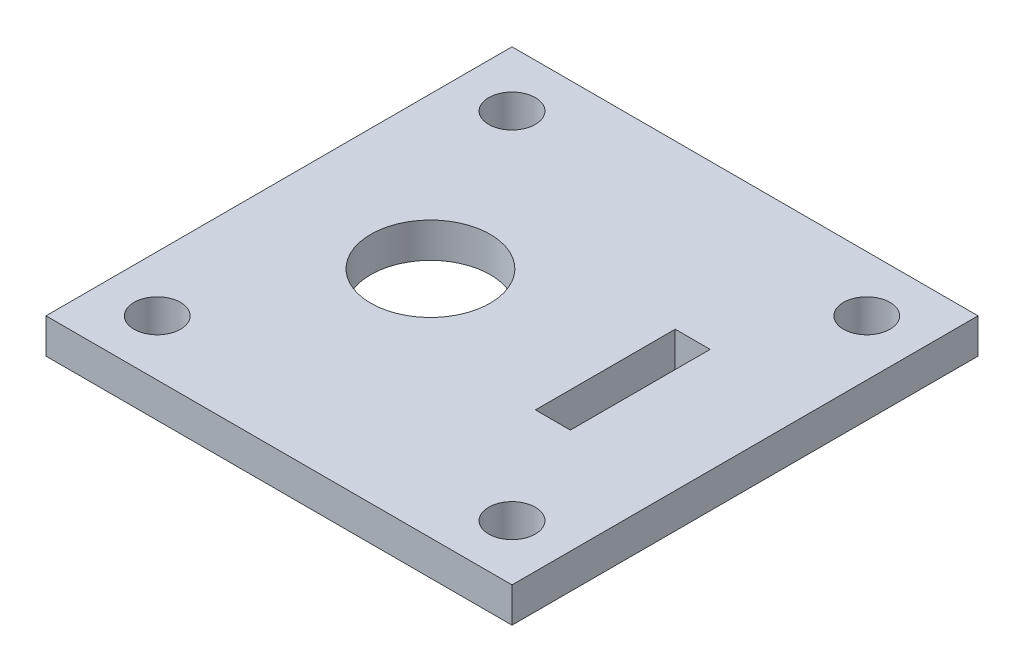
ISO-10303-21;
HEADER;
FILE_DESCRIPTION(('STEP AP214'),'2;1');
FILE_NAME('part.step','',(''),(''),'','','');
FILE_SCHEMA(('AUTOMOTIVE_DESIGN { 1 0 10303 214 1 1 1 1 }'));
ENDSEC;
DATA;
#1=APPLICATION_CONTEXT('core data for automotive mechanical design processes');
#2=APPLICATION_PROTOCOL_DEFINITION('international standard','automotive_design',2000,#1);
#3=PRODUCT_CONTEXT('',#1,'mechanical');
#4=PRODUCT('Part','Part','',(#3));
#5=PRODUCT_RELATED_PRODUCT_CATEGORY('part','',(#4));
#6=PRODUCT_DEFINITION_FORMATION('','',#4);
#7=PRODUCT_DEFINITION_CONTEXT('part definition',#1,'design');
#8=PRODUCT_DEFINITION('design','',#6,#7);
#9=PRODUCT_DEFINITION_SHAPE('','',#8);
#10=(LENGTH_UNIT() NAMED_UNIT(*) SI_UNIT(.MILLI.,.METRE.));
#11=(NAMED_UNIT(*) PLANE_ANGLE_UNIT() SI_UNIT($,.RADIAN.));
#12=(NAMED_UNIT(*) SI_UNIT($,.STERADIAN.) SOLID_ANGLE_UNIT());
#13=UNCERTAINTY_MEASURE_WITH_UNIT(LENGTH_MEASURE(1.E-05),#10,'distance_accuracy_value','');
#14=(GEOMETRIC_REPRESENTATION_CONTEXT(3) GLOBAL_UNCERTAINTY_ASSIGNED_CONTEXT((#13)) GLOBAL_UNIT_ASSIGNED_CONTEXT((#10,
#11,#12)) REPRESENTATION_CONTEXT('',''));
#15=CARTESIAN_POINT('',(0.,0.,0.));
#16=DIRECTION('',(0.,0.,1.));
#17=DIRECTION('',(1.,0.,0.));
#18=AXIS2_PLACEMENT_3D('',#15,#16,#17);
#19=CARTESIAN_POINT('',(-20.,3.,20.));
#20=DIRECTION('',(0.,0.,-1.));
#21=DIRECTION('',(-1.,0.,0.));
#22=AXIS2_PLACEMENT_3D('',#19,#20,#21);
#23=PLANE('',#22);
#24=DIRECTION('',(1.,0.,0.));
#25=VECTOR('',#24,1.);
#26=CARTESIAN_POINT('',(-20.,0.,20.));
#27=LINE('',#26,#25);
#28=CARTESIAN_POINT('',(-20.,0.,20.));
#29=VERTEX_POINT('',#28);
#30=CARTESIAN_POINT('',(20.,0.,20.));
#31=VERTEX_POINT('',#30);
#32=EDGE_CURVE('E192',#29,#31,#27,.T.);
#33=ORIENTED_EDGE('',*,*,#32,.T.);
#34=DIRECTION('',(0.,-1.,0.));
#35=VECTOR('',#34,1.);
#36=CARTESIAN_POINT('',(20.,3.,20.));
#37=LINE('',#36,#35);
#38=CARTESIAN_POINT('',(20.,3.,20.));
#39=VERTEX_POINT('',#38);
#40=EDGE_CURVE('E11',#39,#31,#37,.T.);
#41=ORIENTED_EDGE('',*,*,#40,.F.);
#42=DIRECTION('',(1.,0.,0.));
#43=VECTOR('',#42,1.);
#44=CARTESIAN_POINT('',(-20.,3.,20.));
#45=LINE('',#44,#43);
#46=CARTESIAN_POINT('',(-20.,3.,20.));
#47=VERTEX_POINT('',#46);
#48=EDGE_CURVE('E196',#47,#39,#45,.T.);
#49=ORIENTED_EDGE('',*,*,#48,.F.);
#50=DIRECTION('',(0.,-1.,0.));
#51=VECTOR('',#50,1.);
#52=CARTESIAN_POINT('',(-20.,3.,20.));
#53=LINE('',#52,#51);
#54=EDGE_CURVE('E212',#47,#29,#53,.T.);
#55=ORIENTED_EDGE('',*,*,#54,.T.);
#56=EDGE_LOOP('',(#33,#41,#49,#55));
#57=FACE_BOUND('',#56,.T.);
#58=ADVANCED_FACE('F41',(#57),#23,.F.);
#59=CARTESIAN_POINT('',(20.,3.,20.));
#60=DIRECTION('',(-1.,0.,0.));
#61=DIRECTION('',(0.,0.,1.));
#62=AXIS2_PLACEMENT_3D('',#59,#60,#61);
#63=PLANE('',#62);
#64=DIRECTION('',(0.,0.,-1.));
#65=VECTOR('',#64,1.);
#66=CARTESIAN_POINT('',(20.,0.,20.));
#67=LINE('',#66,#65);
#68=CARTESIAN_POINT('',(20.,0.,-20.));
#69=VERTEX_POINT('',#68);
#70=EDGE_CURVE('E216',#31,#69,#67,.T.);
#71=ORIENTED_EDGE('',*,*,#70,.T.);
#72=DIRECTION('',(0.,-1.,0.));
#73=VECTOR('',#72,1.);
#74=CARTESIAN_POINT('',(20.,3.,-20.));
#75=LINE('',#74,#73);
#76=CARTESIAN_POINT('',(20.,3.,-20.));
#77=VERTEX_POINT('',#76);
#78=EDGE_CURVE('E49',#77,#69,#75,.T.);
#79=ORIENTED_EDGE('',*,*,#78,.F.);
#80=DIRECTION('',(0.,0.,-1.));
#81=VECTOR('',#80,1.);
#82=CARTESIAN_POINT('',(20.,3.,20.));
#83=LINE('',#82,#81);
#84=EDGE_CURVE('E200',#39,#77,#83,.T.);
#85=ORIENTED_EDGE('',*,*,#84,.F.);
#86=ORIENTED_EDGE('',*,*,#40,.T.);
#87=EDGE_LOOP('',(#71,#79,#85,#86));
#88=FACE_BOUND('',#87,.T.);
#89=ADVANCED_FACE('F238',(#88),#63,.F.);
#90=CARTESIAN_POINT('',(-20.,3.,-20.));
#91=DIRECTION('',(0.,0.,-1.));
#92=DIRECTION('',(-1.,0.,0.));
#93=AXIS2_PLACEMENT_3D('',#90,#91,#92);
#94=PLANE('',#93);
#95=DIRECTION('',(1.,0.,0.));
#96=VECTOR('',#95,1.);
#97=CARTESIAN_POINT('',(-20.,0.,-20.));
#98=LINE('',#97,#96);
#99=CARTESIAN_POINT('',(-20.,0.,-20.));
#100=VERTEX_POINT('',#99);
#101=EDGE_CURVE('E220',#100,#69,#98,.T.);
#102=ORIENTED_EDGE('',*,*,#101,.F.);
#103=DIRECTION('',(0.,-1.,0.));
#104=VECTOR('',#103,1.);
#105=CARTESIAN_POINT('',(-20.,3.,-20.));
#106=LINE('',#105,#104);
#107=CARTESIAN_POINT('',(-20.,3.,-20.));
#108=VERTEX_POINT('',#107);
#109=EDGE_CURVE('E229',#108,#100,#106,.T.);
#110=ORIENTED_EDGE('',*,*,#109,.F.);
#111=DIRECTION('',(1.,0.,0.));
#112=VECTOR('',#111,1.);
#113=CARTESIAN_POINT('',(-20.,3.,-20.));
#114=LINE('',#113,#112);
#115=EDGE_CURVE('E204',#108,#77,#114,.T.);
#116=ORIENTED_EDGE('',*,*,#115,.T.);
#117=ORIENTED_EDGE('',*,*,#78,.T.);
#118=EDGE_LOOP('',(#102,#110,#116,#117));
#119=FACE_BOUND('',#118,.T.);
#120=ADVANCED_FACE('F235',(#119),#94,.T.);
#121=CARTESIAN_POINT('',(-20.,3.,20.));
#122=DIRECTION('',(-1.,0.,0.));
#123=DIRECTION('',(0.,0.,1.));
#124=AXIS2_PLACEMENT_3D('',#121,#122,#123);
#125=PLANE('',#124);
#126=DIRECTION('',(0.,0.,-1.));
#127=VECTOR('',#126,1.);
#128=CARTESIAN_POINT('',(-20.,0.,20.));
#129=LINE('',#128,#127);
#130=EDGE_CURVE('E201',#29,#100,#129,.T.);
#131=ORIENTED_EDGE('',*,*,#130,.F.);
#132=ORIENTED_EDGE('',*,*,#54,.F.);
#133=DIRECTION('',(0.,0.,-1.));
#134=VECTOR('',#133,1.);
#135=CARTESIAN_POINT('',(-20.,3.,20.));
#136=LINE('',#135,#134);
#137=EDGE_CURVE('E208',#47,#108,#136,.T.);
#138=ORIENTED_EDGE('',*,*,#137,.T.);
#139=ORIENTED_EDGE('',*,*,#109,.T.);
#140=EDGE_LOOP('',(#131,#132,#138,#139));
#141=FACE_BOUND('',#140,.T.);
#142=ADVANCED_FACE('F245',(#141),#125,.T.);
#143=CARTESIAN_POINT('',(0.,3.,0.));
#144=DIRECTION('',(0.,1.,0.));
#145=DIRECTION('',(0.,0.,1.));
#146=AXIS2_PLACEMENT_3D('',#143,#144,#145);
#147=PLANE('',#146);
#148=CARTESIAN_POINT('',(15.2247989874837,3.,15.2247989874837));
#149=DIRECTION('',(0.,1.,0.));
#150=DIRECTION('',(0.,0.,1.));
#151=AXIS2_PLACEMENT_3D('',#148,#149,#150);
#152=CIRCLE('',#151,2.);
#153=CARTESIAN_POINT('',(15.2247989874837,3.,17.2247989874837));
#154=VERTEX_POINT('',#153);
#155=EDGE_CURVE('E156',#154,#154,#152,.T.);
#156=ORIENTED_EDGE('',*,*,#155,.F.);
#157=EDGE_LOOP('',(#156));
#158=FACE_BOUND('',#157,.T.);
#159=CARTESIAN_POINT('',(15.2247989874837,3.,-15.2247989874837));
#160=DIRECTION('',(0.,1.,0.));
#161=DIRECTION('',(0.,0.,1.));
#162=AXIS2_PLACEMENT_3D('',#159,#160,#161);
#163=CIRCLE('',#162,2.);
#164=CARTESIAN_POINT('',(15.2247989874837,3.,-13.2247989874837));
#165=VERTEX_POINT('',#164);
#166=EDGE_CURVE('E165',#165,#165,#163,.T.);
#167=ORIENTED_EDGE('',*,*,#166,.F.);
#168=EDGE_LOOP('',(#167));
#169=FACE_BOUND('',#168,.T.);
#170=CARTESIAN_POINT('',(-15.2247989874837,3.,-15.2247989874837));
#171=DIRECTION('',(0.,1.,0.));
#172=DIRECTION('',(0.,0.,1.));
#173=AXIS2_PLACEMENT_3D('',#170,#171,#172);
#174=CIRCLE('',#173,2.);
#175=CARTESIAN_POINT('',(-15.2247989874837,3.,-13.2247989874837));
#176=VERTEX_POINT('',#175);
#177=EDGE_CURVE('E173',#176,#176,#174,.T.);
#178=ORIENTED_EDGE('',*,*,#177,.F.);
#179=EDGE_LOOP('',(#178));
#180=FACE_BOUND('',#179,.T.);
#181=CARTESIAN_POINT('',(-7.,3.,0.));
#182=DIRECTION('',(0.,1.,0.));
#183=DIRECTION('',(0.,0.,1.));
#184=AXIS2_PLACEMENT_3D('',#181,#182,#183);
#185=CIRCLE('',#184,5.125);
#186=CARTESIAN_POINT('',(-7.,3.,5.125));
#187=VERTEX_POINT('',#186);
#188=EDGE_CURVE('E181',#187,#187,#185,.T.);
#189=ORIENTED_EDGE('',*,*,#188,.F.);
#190=EDGE_LOOP('',(#189));
#191=FACE_BOUND('',#190,.T.);
#192=DIRECTION('',(1.,0.,0.));
#193=VECTOR('',#192,1.);
#194=CARTESIAN_POINT('',(8.,3.,5.9883944628134));
#195=LINE('',#194,#193);
#196=CARTESIAN_POINT('',(8.,3.,5.9883944628134));
#197=VERTEX_POINT('',#196);
#198=CARTESIAN_POINT('',(11.,3.,5.9883944628134));
#199=VERTEX_POINT('',#198);
#200=EDGE_CURVE('E115',#197,#199,#195,.T.);
#201=ORIENTED_EDGE('',*,*,#200,.F.);
#202=DIRECTION('',(0.,0.,1.));
#203=VECTOR('',#202,1.);
#204=CARTESIAN_POINT('',(8.,3.,-6.0116055371866));
#205=LINE('',#204,#203);
#206=CARTESIAN_POINT('',(8.,3.,-6.0116055371866));
#207=VERTEX_POINT('',#206);
#208=EDGE_CURVE('E106',#207,#197,#205,.T.);
#209=ORIENTED_EDGE('',*,*,#208,.F.);
#210=DIRECTION('',(-1.,0.,0.));
#211=VECTOR('',#210,1.);
#212=CARTESIAN_POINT('',(8.,3.,-6.0116055371866));
#213=LINE('',#212,#211);
#214=CARTESIAN_POINT('',(11.,3.,-6.0116055371866));
#215=VERTEX_POINT('',#214);
#216=EDGE_CURVE('E134',#215,#207,#213,.T.);
#217=ORIENTED_EDGE('',*,*,#216,.F.);
#218=DIRECTION('',(0.,0.,-1.));
#219=VECTOR('',#218,1.);
#220=CARTESIAN_POINT('',(11.,3.,-6.0116055371866));
#221=LINE('',#220,#219);
#222=EDGE_CURVE('E130',#199,#215,#221,.T.);
#223=ORIENTED_EDGE('',*,*,#222,.F.);
#224=EDGE_LOOP('',(#201,#209,#217,#223));
#225=FACE_BOUND('',#224,.T.);
#226=CARTESIAN_POINT('',(-15.2247989874837,3.,15.2247989874837));
#227=DIRECTION('',(0.,1.,0.));
#228=DIRECTION('',(0.,0.,1.));
#229=AXIS2_PLACEMENT_3D('',#226,#227,#228);
#230=CIRCLE('',#229,2.);
#231=CARTESIAN_POINT('',(-15.2247989874837,3.,17.2247989874837));
#232=VERTEX_POINT('',#231);
#233=EDGE_CURVE('E188',#232,#232,#230,.T.);
#234=ORIENTED_EDGE('',*,*,#233,.F.);
#235=EDGE_LOOP('',(#234));
#236=FACE_BOUND('',#235,.T.);
#237=ORIENTED_EDGE('',*,*,#48,.T.);
#238=ORIENTED_EDGE('',*,*,#84,.T.);
#239=ORIENTED_EDGE('',*,*,#115,.F.);
#240=ORIENTED_EDGE('',*,*,#137,.F.);
#241=EDGE_LOOP('',(#237,#238,#239,#240));
#242=FACE_BOUND('',#241,.T.);
#243=ADVANCED_FACE('F128',(#158,#169,#180,#191,#225,#236,#242),#147,.T.);
#244=CARTESIAN_POINT('',(0.,0.,0.));
#245=DIRECTION('',(0.,1.,0.));
#246=DIRECTION('',(0.,0.,1.));
#247=AXIS2_PLACEMENT_3D('',#244,#245,#246);
#248=PLANE('',#247);
#249=CARTESIAN_POINT('',(15.2247989874837,0.,15.2247989874837));
#250=DIRECTION('',(0.,1.,0.));
#251=DIRECTION('',(0.,0.,1.));
#252=AXIS2_PLACEMENT_3D('',#249,#250,#251);
#253=CIRCLE('',#252,2.);
#254=CARTESIAN_POINT('',(15.2247989874837,0.,17.2247989874837));
#255=VERTEX_POINT('',#254);
#256=EDGE_CURVE('E161',#255,#255,#253,.T.);
#257=ORIENTED_EDGE('',*,*,#256,.T.);
#258=EDGE_LOOP('',(#257));
#259=FACE_BOUND('',#258,.T.);
#260=CARTESIAN_POINT('',(15.2247989874837,0.,-15.2247989874837));
#261=DIRECTION('',(0.,1.,0.));
#262=DIRECTION('',(0.,0.,1.));
#263=AXIS2_PLACEMENT_3D('',#260,#261,#262);
#264=CIRCLE('',#263,2.);
#265=CARTESIAN_POINT('',(15.2247989874837,0.,-13.2247989874837));
#266=VERTEX_POINT('',#265);
#267=EDGE_CURVE('E169',#266,#266,#264,.T.);
#268=ORIENTED_EDGE('',*,*,#267,.T.);
#269=EDGE_LOOP('',(#268));
#270=FACE_BOUND('',#269,.T.);
#271=CARTESIAN_POINT('',(-15.2247989874837,0.,-15.2247989874837));
#272=DIRECTION('',(0.,1.,0.));
#273=DIRECTION('',(0.,0.,1.));
#274=AXIS2_PLACEMENT_3D('',#271,#272,#273);
#275=CIRCLE('',#274,2.);
#276=CARTESIAN_POINT('',(-15.2247989874837,0.,-13.2247989874837));
#277=VERTEX_POINT('',#276);
#278=EDGE_CURVE('E177',#277,#277,#275,.T.);
#279=ORIENTED_EDGE('',*,*,#278,.T.);
#280=EDGE_LOOP('',(#279));
#281=FACE_BOUND('',#280,.T.);
#282=CARTESIAN_POINT('',(-7.,0.,0.));
#283=DIRECTION('',(0.,1.,0.));
#284=DIRECTION('',(0.,0.,1.));
#285=AXIS2_PLACEMENT_3D('',#282,#283,#284);
#286=CIRCLE('',#285,5.125);
#287=CARTESIAN_POINT('',(-7.,0.,5.125));
#288=VERTEX_POINT('',#287);
#289=EDGE_CURVE('E124',#288,#288,#286,.T.);
#290=ORIENTED_EDGE('',*,*,#289,.T.);
#291=EDGE_LOOP('',(#290));
#292=FACE_BOUND('',#291,.T.);
#293=DIRECTION('',(0.,0.,1.));
#294=VECTOR('',#293,1.);
#295=CARTESIAN_POINT('',(8.,0.,-6.0116055371866));
#296=LINE('',#295,#294);
#297=CARTESIAN_POINT('',(8.,0.,-6.0116055371866));
#298=VERTEX_POINT('',#297);
#299=CARTESIAN_POINT('',(8.,0.,5.9883944628134));
#300=VERTEX_POINT('',#299);
#301=EDGE_CURVE('E64',#298,#300,#296,.T.);
#302=ORIENTED_EDGE('',*,*,#301,.T.);
#303=DIRECTION('',(1.,0.,0.));
#304=VECTOR('',#303,1.);
#305=CARTESIAN_POINT('',(8.,0.,5.9883944628134));
#306=LINE('',#305,#304);
#307=CARTESIAN_POINT('',(11.,0.,5.9883944628134));
#308=VERTEX_POINT('',#307);
#309=EDGE_CURVE('E122',#300,#308,#306,.T.);
#310=ORIENTED_EDGE('',*,*,#309,.T.);
#311=DIRECTION('',(0.,0.,-1.));
#312=VECTOR('',#311,1.);
#313=CARTESIAN_POINT('',(11.,0.,-6.0116055371866));
#314=LINE('',#313,#312);
#315=CARTESIAN_POINT('',(11.,0.,-6.0116055371866));
#316=VERTEX_POINT('',#315);
#317=EDGE_CURVE('E143',#308,#316,#314,.T.);
#318=ORIENTED_EDGE('',*,*,#317,.T.);
#319=DIRECTION('',(-1.,0.,0.));
#320=VECTOR('',#319,1.);
#321=CARTESIAN_POINT('',(8.,0.,-6.0116055371866));
#322=LINE('',#321,#320);
#323=EDGE_CURVE('E116',#316,#298,#322,.T.);
#324=ORIENTED_EDGE('',*,*,#323,.T.);
#325=EDGE_LOOP('',(#302,#310,#318,#324));
#326=FACE_BOUND('',#325,.T.);
#327=CARTESIAN_POINT('',(-15.2247989874837,0.,15.2247989874837));
#328=DIRECTION('',(0.,1.,0.));
#329=DIRECTION('',(0.,0.,1.));
#330=AXIS2_PLACEMENT_3D('',#327,#328,#329);
#331=CIRCLE('',#330,2.);
#332=CARTESIAN_POINT('',(-15.2247989874837,0.,17.2247989874837));
#333=VERTEX_POINT('',#332);
#334=EDGE_CURVE('E160',#333,#333,#331,.T.);
#335=ORIENTED_EDGE('',*,*,#334,.T.);
#336=EDGE_LOOP('',(#335));
#337=FACE_BOUND('',#336,.T.);
#338=ORIENTED_EDGE('',*,*,#32,.F.);
#339=ORIENTED_EDGE('',*,*,#130,.T.);
#340=ORIENTED_EDGE('',*,*,#101,.T.);
#341=ORIENTED_EDGE('',*,*,#70,.F.);
#342=EDGE_LOOP('',(#338,#339,#340,#341));
#343=FACE_BOUND('',#342,.T.);
#344=ADVANCED_FACE('F242',(#259,#270,#281,#292,#326,#337,#343),#248,.F.);
#345=CARTESIAN_POINT('',(-15.2247989874837,3.,15.2247989874837));
#346=DIRECTION('',(0.,-1.,0.));
#347=DIRECTION('',(0.,0.,-1.));
#348=AXIS2_PLACEMENT_3D('',#345,#346,#347);
#349=CYLINDRICAL_SURFACE('',#348,2.);
#350=ORIENTED_EDGE('',*,*,#233,.T.);
#351=EDGE_LOOP('',(#350));
#352=FACE_BOUND('',#351,.T.);
#353=ORIENTED_EDGE('',*,*,#334,.F.);
#354=EDGE_LOOP('',(#353));
#355=FACE_BOUND('',#354,.T.);
#356=ADVANCED_FACE('F263',(#352,#355),#349,.F.);
#357=CARTESIAN_POINT('',(8.,3.,-6.0116055371866));
#358=DIRECTION('',(1.,0.,0.));
#359=DIRECTION('',(0.,0.,-1.));
#360=AXIS2_PLACEMENT_3D('',#357,#358,#359);
#361=PLANE('',#360);
#362=ORIENTED_EDGE('',*,*,#301,.F.);
#363=DIRECTION('',(0.,-1.,0.));
#364=VECTOR('',#363,1.);
#365=CARTESIAN_POINT('',(8.,3.,-6.0116055371866));
#366=LINE('',#365,#364);
#367=EDGE_CURVE('E110',#207,#298,#366,.T.);
#368=ORIENTED_EDGE('',*,*,#367,.F.);
#369=ORIENTED_EDGE('',*,*,#208,.T.);
#370=DIRECTION('',(0.,-1.,0.));
#371=VECTOR('',#370,1.);
#372=CARTESIAN_POINT('',(8.,3.,5.9883944628134));
#373=LINE('',#372,#371);
#374=EDGE_CURVE('E109',#197,#300,#373,.T.);
#375=ORIENTED_EDGE('',*,*,#374,.T.);
#376=EDGE_LOOP('',(#362,#368,#369,#375));
#377=FACE_BOUND('',#376,.T.);
#378=ADVANCED_FACE('F108',(#377),#361,.T.);
#379=CARTESIAN_POINT('',(8.,3.,5.9883944628134));
#380=DIRECTION('',(0.,0.,-1.));
#381=DIRECTION('',(-1.,0.,0.));
#382=AXIS2_PLACEMENT_3D('',#379,#380,#381);
#383=PLANE('',#382);
#384=ORIENTED_EDGE('',*,*,#309,.F.);
#385=ORIENTED_EDGE('',*,*,#374,.F.);
#386=ORIENTED_EDGE('',*,*,#200,.T.);
#387=DIRECTION('',(0.,-1.,0.));
#388=VECTOR('',#387,1.);
#389=CARTESIAN_POINT('',(11.,3.,5.9883944628134));
#390=LINE('',#389,#388);
#391=EDGE_CURVE('E125',#199,#308,#390,.T.);
#392=ORIENTED_EDGE('',*,*,#391,.T.);
#393=EDGE_LOOP('',(#384,#385,#386,#392));
#394=FACE_BOUND('',#393,.T.);
#395=ADVANCED_FACE('F119',(#394),#383,.T.);
#396=CARTESIAN_POINT('',(11.,3.,-6.0116055371866));
#397=DIRECTION('',(-1.,0.,0.));
#398=DIRECTION('',(0.,0.,1.));
#399=AXIS2_PLACEMENT_3D('',#396,#397,#398);
#400=PLANE('',#399);
#401=ORIENTED_EDGE('',*,*,#317,.F.);
#402=ORIENTED_EDGE('',*,*,#391,.F.);
#403=ORIENTED_EDGE('',*,*,#222,.T.);
#404=DIRECTION('',(0.,-1.,0.));
#405=VECTOR('',#404,1.);
#406=CARTESIAN_POINT('',(11.,3.,-6.0116055371866));
#407=LINE('',#406,#405);
#408=EDGE_CURVE('E56',#215,#316,#407,.T.);
#409=ORIENTED_EDGE('',*,*,#408,.T.);
#410=EDGE_LOOP('',(#401,#402,#403,#409));
#411=FACE_BOUND('',#410,.T.);
#412=ADVANCED_FACE('F292',(#411),#400,.T.);
#413=CARTESIAN_POINT('',(8.,3.,-6.0116055371866));
#414=DIRECTION('',(0.,0.,1.));
#415=DIRECTION('',(1.,0.,0.));
#416=AXIS2_PLACEMENT_3D('',#413,#414,#415);
#417=PLANE('',#416);
#418=ORIENTED_EDGE('',*,*,#323,.F.);
#419=ORIENTED_EDGE('',*,*,#408,.F.);
#420=ORIENTED_EDGE('',*,*,#216,.T.);
#421=ORIENTED_EDGE('',*,*,#367,.T.);
#422=EDGE_LOOP('',(#418,#419,#420,#421));
#423=FACE_BOUND('',#422,.T.);
#424=ADVANCED_FACE('F275',(#423),#417,.T.);
#425=CARTESIAN_POINT('',(-7.,3.,0.));
#426=DIRECTION('',(0.,-1.,0.));
#427=DIRECTION('',(0.,0.,-1.));
#428=AXIS2_PLACEMENT_3D('',#425,#426,#427);
#429=CYLINDRICAL_SURFACE('',#428,5.125);
#430=ORIENTED_EDGE('',*,*,#188,.T.);
#431=EDGE_LOOP('',(#430));
#432=FACE_BOUND('',#431,.T.);
#433=ORIENTED_EDGE('',*,*,#289,.F.);
#434=EDGE_LOOP('',(#433));
#435=FACE_BOUND('',#434,.T.);
#436=ADVANCED_FACE('F271',(#432,#435),#429,.F.);
#437=CARTESIAN_POINT('',(-15.2247989874837,3.,-15.2247989874837));
#438=DIRECTION('',(0.,-1.,0.));
#439=DIRECTION('',(0.,0.,-1.));
#440=AXIS2_PLACEMENT_3D('',#437,#438,#439);
#441=CYLINDRICAL_SURFACE('',#440,2.);
#442=ORIENTED_EDGE('',*,*,#177,.T.);
#443=EDGE_LOOP('',(#442));
#444=FACE_BOUND('',#443,.T.);
#445=ORIENTED_EDGE('',*,*,#278,.F.);
#446=EDGE_LOOP('',(#445));
#447=FACE_BOUND('',#446,.T.);
#448=ADVANCED_FACE('F274',(#444,#447),#441,.F.);
#449=CARTESIAN_POINT('',(15.2247989874837,3.,-15.2247989874837));
#450=DIRECTION('',(0.,-1.,0.));
#451=DIRECTION('',(0.,0.,-1.));
#452=AXIS2_PLACEMENT_3D('',#449,#450,#451);
#453=CYLINDRICAL_SURFACE('',#452,2.);
#454=ORIENTED_EDGE('',*,*,#166,.T.);
#455=EDGE_LOOP('',(#454));
#456=FACE_BOUND('',#455,.T.);
#457=ORIENTED_EDGE('',*,*,#267,.F.);
#458=EDGE_LOOP('',(#457));
#459=FACE_BOUND('',#458,.T.);
#460=ADVANCED_FACE('F279',(#456,#459),#453,.F.);
#461=CARTESIAN_POINT('',(15.2247989874837,3.,15.2247989874837));
#462=DIRECTION('',(0.,-1.,0.));
#463=DIRECTION('',(0.,0.,-1.));
#464=AXIS2_PLACEMENT_3D('',#461,#462,#463);
#465=CYLINDRICAL_SURFACE('',#464,2.);
#466=ORIENTED_EDGE('',*,*,#155,.T.);
#467=EDGE_LOOP('',(#466));
#468=FACE_BOUND('',#467,.T.);
#469=ORIENTED_EDGE('',*,*,#256,.F.);
#470=EDGE_LOOP('',(#469));
#471=FACE_BOUND('',#470,.T.);
#472=ADVANCED_FACE('F283',(#468,#471),#465,.F.);
#473=CLOSED_SHELL('',(#58,#89,#120,#142,#243,#344,#356,#378,#395,#412,#424,#436,#448,#460,#472));
#474=MANIFOLD_SOLID_BREP('B2',#473);
#475=ADVANCED_BREP_SHAPE_REPRESENTATION('',(#18,#474),#14);
#476=SHAPE_DEFINITION_REPRESENTATION(#9,#475);
ENDSEC;
END-ISO-10303-21;
